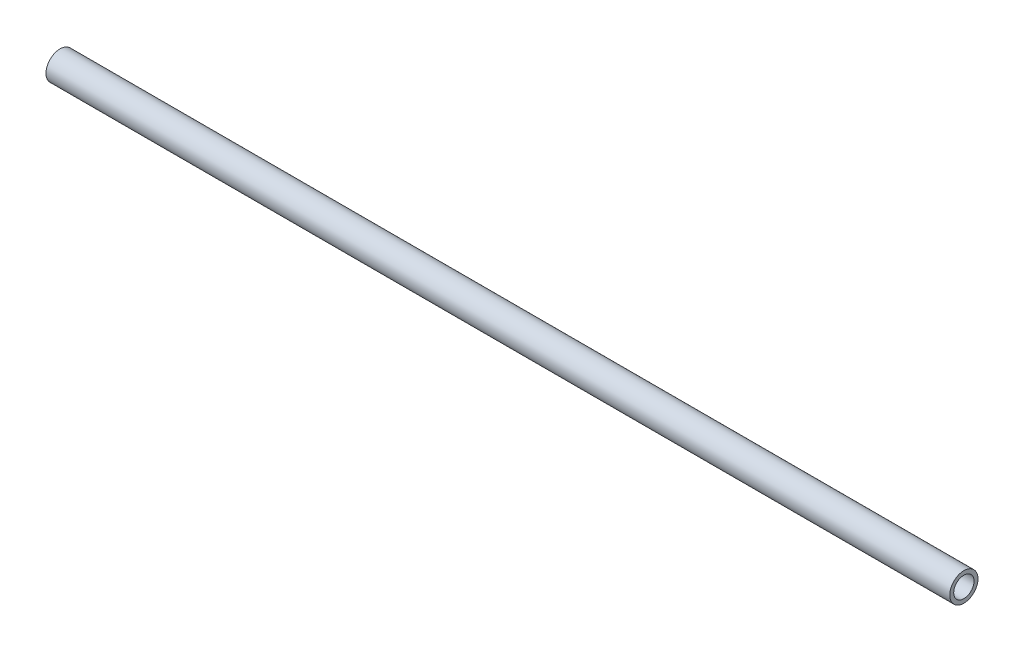
ISO-10303-21;
HEADER;
FILE_DESCRIPTION(('STEP AP214'),'2;1');
FILE_NAME('part.step','',(''),(''),'','','');
FILE_SCHEMA(('AUTOMOTIVE_DESIGN { 1 0 10303 214 1 1 1 1 }'));
ENDSEC;
DATA;
#1=APPLICATION_CONTEXT('core data for automotive mechanical design processes');
#2=APPLICATION_PROTOCOL_DEFINITION('international standard','automotive_design',2000,#1);
#3=PRODUCT_CONTEXT('',#1,'mechanical');
#4=PRODUCT('Part','Part','',(#3));
#5=PRODUCT_RELATED_PRODUCT_CATEGORY('part','',(#4));
#6=PRODUCT_DEFINITION_FORMATION('','',#4);
#7=PRODUCT_DEFINITION_CONTEXT('part definition',#1,'design');
#8=PRODUCT_DEFINITION('design','',#6,#7);
#9=PRODUCT_DEFINITION_SHAPE('','',#8);
#10=(LENGTH_UNIT() NAMED_UNIT(*) SI_UNIT(.MILLI.,.METRE.));
#11=(NAMED_UNIT(*) PLANE_ANGLE_UNIT() SI_UNIT($,.RADIAN.));
#12=(NAMED_UNIT(*) SI_UNIT($,.STERADIAN.) SOLID_ANGLE_UNIT());
#13=UNCERTAINTY_MEASURE_WITH_UNIT(LENGTH_MEASURE(1.E-05),#10,'distance_accuracy_value','');
#14=(GEOMETRIC_REPRESENTATION_CONTEXT(3) GLOBAL_UNCERTAINTY_ASSIGNED_CONTEXT((#13)) GLOBAL_UNIT_ASSIGNED_CONTEXT((#10,
#11,#12)) REPRESENTATION_CONTEXT('',''));
#15=CARTESIAN_POINT('',(0.,0.,0.));
#16=DIRECTION('',(0.,0.,1.));
#17=DIRECTION('',(1.,0.,0.));
#18=AXIS2_PLACEMENT_3D('',#15,#16,#17);
#19=CARTESIAN_POINT('',(101.6,0.,0.));
#20=DIRECTION('',(1.,0.,0.));
#21=DIRECTION('',(0.,0.,-1.));
#22=AXIS2_PLACEMENT_3D('',#19,#20,#21);
#23=PLANE('',#22);
#24=CARTESIAN_POINT('',(101.6,0.,0.));
#25=DIRECTION('',(1.,0.,0.));
#26=DIRECTION('',(0.,0.,-1.));
#27=AXIS2_PLACEMENT_3D('',#24,#25,#26);
#28=CIRCLE('',#27,3.175);
#29=CARTESIAN_POINT('',(101.6,0.,-3.175));
#30=VERTEX_POINT('',#29);
#31=EDGE_CURVE('E10',#30,#30,#28,.T.);
#32=ORIENTED_EDGE('',*,*,#31,.T.);
#33=EDGE_LOOP('',(#32));
#34=FACE_BOUND('',#33,.T.);
#35=CARTESIAN_POINT('',(101.6,0.,0.));
#36=DIRECTION('',(1.,0.,0.));
#37=DIRECTION('',(0.,0.,-1.));
#38=AXIS2_PLACEMENT_3D('',#35,#36,#37);
#39=CIRCLE('',#38,2.286);
#40=CARTESIAN_POINT('',(101.6,0.,-2.286));
#41=VERTEX_POINT('',#40);
#42=EDGE_CURVE('E43',#41,#41,#39,.T.);
#43=ORIENTED_EDGE('',*,*,#42,.F.);
#44=EDGE_LOOP('',(#43));
#45=FACE_BOUND('',#44,.T.);
#46=ADVANCED_FACE('F32',(#34,#45),#23,.T.);
#47=CARTESIAN_POINT('',(-101.6,0.,0.));
#48=DIRECTION('',(1.,0.,0.));
#49=DIRECTION('',(0.,0.,-1.));
#50=AXIS2_PLACEMENT_3D('',#47,#48,#49);
#51=PLANE('',#50);
#52=CARTESIAN_POINT('',(-101.6,0.,0.));
#53=DIRECTION('',(1.,0.,0.));
#54=DIRECTION('',(0.,0.,-1.));
#55=AXIS2_PLACEMENT_3D('',#52,#53,#54);
#56=CIRCLE('',#55,3.175);
#57=CARTESIAN_POINT('',(-101.6,0.,-3.175));
#58=VERTEX_POINT('',#57);
#59=EDGE_CURVE('E36',#58,#58,#56,.T.);
#60=ORIENTED_EDGE('',*,*,#59,.F.);
#61=EDGE_LOOP('',(#60));
#62=FACE_BOUND('',#61,.T.);
#63=CARTESIAN_POINT('',(-101.6,0.,0.));
#64=DIRECTION('',(1.,0.,0.));
#65=DIRECTION('',(0.,0.,-1.));
#66=AXIS2_PLACEMENT_3D('',#63,#64,#65);
#67=CIRCLE('',#66,2.286);
#68=CARTESIAN_POINT('',(-101.6,0.,-2.286));
#69=VERTEX_POINT('',#68);
#70=EDGE_CURVE('E45',#69,#69,#67,.T.);
#71=ORIENTED_EDGE('',*,*,#70,.T.);
#72=EDGE_LOOP('',(#71));
#73=FACE_BOUND('',#72,.T.);
#74=ADVANCED_FACE('F55',(#62,#73),#51,.F.);
#75=CARTESIAN_POINT('',(101.6,0.,0.));
#76=DIRECTION('',(-1.,0.,0.));
#77=DIRECTION('',(0.,0.,1.));
#78=AXIS2_PLACEMENT_3D('',#75,#76,#77);
#79=CYLINDRICAL_SURFACE('',#78,3.175);
#80=ORIENTED_EDGE('',*,*,#31,.F.);
#81=EDGE_LOOP('',(#80));
#82=FACE_BOUND('',#81,.T.);
#83=ORIENTED_EDGE('',*,*,#59,.T.);
#84=EDGE_LOOP('',(#83));
#85=FACE_BOUND('',#84,.T.);
#86=ADVANCED_FACE('F34',(#82,#85),#79,.T.);
#87=CARTESIAN_POINT('',(101.6,0.,0.));
#88=DIRECTION('',(-1.,0.,0.));
#89=DIRECTION('',(0.,0.,1.));
#90=AXIS2_PLACEMENT_3D('',#87,#88,#89);
#91=CYLINDRICAL_SURFACE('',#90,2.286);
#92=ORIENTED_EDGE('',*,*,#42,.T.);
#93=EDGE_LOOP('',(#92));
#94=FACE_BOUND('',#93,.T.);
#95=ORIENTED_EDGE('',*,*,#70,.F.);
#96=EDGE_LOOP('',(#95));
#97=FACE_BOUND('',#96,.T.);
#98=ADVANCED_FACE('F51',(#94,#97),#91,.F.);
#99=CLOSED_SHELL('',(#46,#74,#86,#98));
#100=MANIFOLD_SOLID_BREP('B2',#99);
#101=ADVANCED_BREP_SHAPE_REPRESENTATION('',(#18,#100),#14);
#102=SHAPE_DEFINITION_REPRESENTATION(#9,#101);
ENDSEC;
END-ISO-10303-21;
